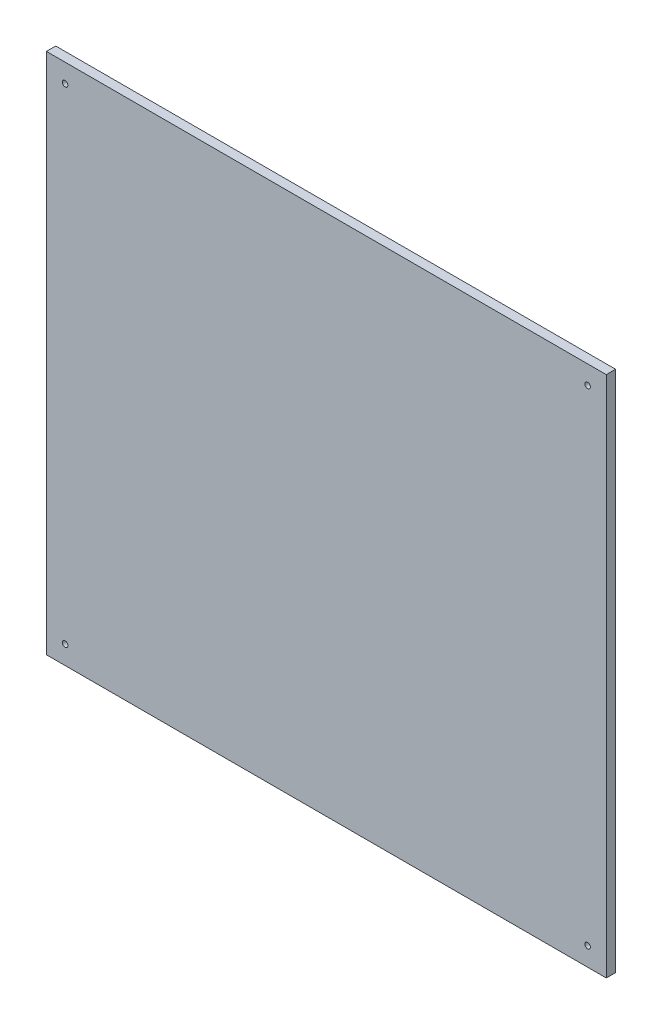
ISO-10303-21;
HEADER;
FILE_DESCRIPTION(('STEP AP214'),'2;1');
FILE_NAME('part.step','',(''),(''),'','','');
FILE_SCHEMA(('AUTOMOTIVE_DESIGN { 1 0 10303 214 1 1 1 1 }'));
ENDSEC;
DATA;
#1=APPLICATION_CONTEXT('core data for automotive mechanical design processes');
#2=APPLICATION_PROTOCOL_DEFINITION('international standard','automotive_design',2000,#1);
#3=PRODUCT_CONTEXT('',#1,'mechanical');
#4=PRODUCT('Part','Part','',(#3));
#5=PRODUCT_RELATED_PRODUCT_CATEGORY('part','',(#4));
#6=PRODUCT_DEFINITION_FORMATION('','',#4);
#7=PRODUCT_DEFINITION_CONTEXT('part definition',#1,'design');
#8=PRODUCT_DEFINITION('design','',#6,#7);
#9=PRODUCT_DEFINITION_SHAPE('','',#8);
#10=(LENGTH_UNIT() NAMED_UNIT(*) SI_UNIT(.MILLI.,.METRE.));
#11=(NAMED_UNIT(*) PLANE_ANGLE_UNIT() SI_UNIT($,.RADIAN.));
#12=(NAMED_UNIT(*) SI_UNIT($,.STERADIAN.) SOLID_ANGLE_UNIT());
#13=UNCERTAINTY_MEASURE_WITH_UNIT(LENGTH_MEASURE(1.E-05),#10,'distance_accuracy_value','');
#14=(GEOMETRIC_REPRESENTATION_CONTEXT(3) GLOBAL_UNCERTAINTY_ASSIGNED_CONTEXT((#13)) GLOBAL_UNIT_ASSIGNED_CONTEXT((#10,
#11,#12)) REPRESENTATION_CONTEXT('',''));
#15=CARTESIAN_POINT('',(0.,0.,0.));
#16=DIRECTION('',(0.,0.,1.));
#17=DIRECTION('',(1.,0.,0.));
#18=AXIS2_PLACEMENT_3D('',#15,#16,#17);
#19=CARTESIAN_POINT('',(0.,0.,5.));
#20=DIRECTION('',(1.,0.,0.));
#21=DIRECTION('',(0.,0.,-1.));
#22=AXIS2_PLACEMENT_3D('',#19,#20,#21);
#23=PLANE('',#22);
#24=DIRECTION('',(0.,-1.,0.));
#25=VECTOR('',#24,1.);
#26=CARTESIAN_POINT('',(0.,0.,0.));
#27=LINE('',#26,#25);
#28=CARTESIAN_POINT('',(0.,280.,0.));
#29=VERTEX_POINT('',#28);
#30=CARTESIAN_POINT('',(0.,0.,0.));
#31=VERTEX_POINT('',#30);
#32=EDGE_CURVE('E96',#29,#31,#27,.T.);
#33=ORIENTED_EDGE('',*,*,#32,.T.);
#34=DIRECTION('',(0.,0.,-1.));
#35=VECTOR('',#34,1.);
#36=CARTESIAN_POINT('',(0.,0.,5.));
#37=LINE('',#36,#35);
#38=CARTESIAN_POINT('',(0.,0.,5.));
#39=VERTEX_POINT('',#38);
#40=EDGE_CURVE('E11',#39,#31,#37,.T.);
#41=ORIENTED_EDGE('',*,*,#40,.F.);
#42=DIRECTION('',(0.,-1.,0.));
#43=VECTOR('',#42,1.);
#44=CARTESIAN_POINT('',(0.,0.,5.));
#45=LINE('',#44,#43);
#46=CARTESIAN_POINT('',(0.,280.,5.));
#47=VERTEX_POINT('',#46);
#48=EDGE_CURVE('E84',#47,#39,#45,.T.);
#49=ORIENTED_EDGE('',*,*,#48,.F.);
#50=DIRECTION('',(0.,0.,-1.));
#51=VECTOR('',#50,1.);
#52=CARTESIAN_POINT('',(0.,280.,5.));
#53=LINE('',#52,#51);
#54=EDGE_CURVE('E92',#47,#29,#53,.T.);
#55=ORIENTED_EDGE('',*,*,#54,.T.);
#56=EDGE_LOOP('',(#33,#41,#49,#55));
#57=FACE_BOUND('',#56,.T.);
#58=ADVANCED_FACE('F33',(#57),#23,.F.);
#59=CARTESIAN_POINT('',(0.,0.,5.));
#60=DIRECTION('',(0.,1.,0.));
#61=DIRECTION('',(0.,0.,1.));
#62=AXIS2_PLACEMENT_3D('',#59,#60,#61);
#63=PLANE('',#62);
#64=DIRECTION('',(1.,0.,0.));
#65=VECTOR('',#64,1.);
#66=CARTESIAN_POINT('',(0.,0.,0.));
#67=LINE('',#66,#65);
#68=CARTESIAN_POINT('',(300.,0.,0.));
#69=VERTEX_POINT('',#68);
#70=EDGE_CURVE('E88',#31,#69,#67,.T.);
#71=ORIENTED_EDGE('',*,*,#70,.T.);
#72=DIRECTION('',(0.,0.,-1.));
#73=VECTOR('',#72,1.);
#74=CARTESIAN_POINT('',(300.,0.,5.));
#75=LINE('',#74,#73);
#76=CARTESIAN_POINT('',(300.,0.,5.));
#77=VERTEX_POINT('',#76);
#78=EDGE_CURVE('E41',#77,#69,#75,.T.);
#79=ORIENTED_EDGE('',*,*,#78,.F.);
#80=DIRECTION('',(1.,0.,0.));
#81=VECTOR('',#80,1.);
#82=CARTESIAN_POINT('',(0.,0.,5.));
#83=LINE('',#82,#81);
#84=EDGE_CURVE('E79',#39,#77,#83,.T.);
#85=ORIENTED_EDGE('',*,*,#84,.F.);
#86=ORIENTED_EDGE('',*,*,#40,.T.);
#87=EDGE_LOOP('',(#71,#79,#85,#86));
#88=FACE_BOUND('',#87,.T.);
#89=ADVANCED_FACE('F87',(#88),#63,.F.);
#90=CARTESIAN_POINT('',(300.,0.,5.));
#91=DIRECTION('',(-1.,0.,0.));
#92=DIRECTION('',(0.,0.,1.));
#93=AXIS2_PLACEMENT_3D('',#90,#91,#92);
#94=PLANE('',#93);
#95=DIRECTION('',(0.,1.,0.));
#96=VECTOR('',#95,1.);
#97=CARTESIAN_POINT('',(300.,0.,0.));
#98=LINE('',#97,#96);
#99=CARTESIAN_POINT('',(300.,280.,0.));
#100=VERTEX_POINT('',#99);
#101=EDGE_CURVE('E66',#69,#100,#98,.T.);
#102=ORIENTED_EDGE('',*,*,#101,.T.);
#103=DIRECTION('',(0.,0.,-1.));
#104=VECTOR('',#103,1.);
#105=CARTESIAN_POINT('',(300.,280.,5.));
#106=LINE('',#105,#104);
#107=CARTESIAN_POINT('',(300.,280.,5.));
#108=VERTEX_POINT('',#107);
#109=EDGE_CURVE('E89',#108,#100,#106,.T.);
#110=ORIENTED_EDGE('',*,*,#109,.F.);
#111=DIRECTION('',(0.,1.,0.));
#112=VECTOR('',#111,1.);
#113=CARTESIAN_POINT('',(300.,0.,5.));
#114=LINE('',#113,#112);
#115=EDGE_CURVE('E82',#77,#108,#114,.T.);
#116=ORIENTED_EDGE('',*,*,#115,.F.);
#117=ORIENTED_EDGE('',*,*,#78,.T.);
#118=EDGE_LOOP('',(#102,#110,#116,#117));
#119=FACE_BOUND('',#118,.T.);
#120=ADVANCED_FACE('F90',(#119),#94,.F.);
#121=CARTESIAN_POINT('',(0.,280.,5.));
#122=DIRECTION('',(0.,-1.,0.));
#123=DIRECTION('',(0.,0.,-1.));
#124=AXIS2_PLACEMENT_3D('',#121,#122,#123);
#125=PLANE('',#124);
#126=DIRECTION('',(-1.,0.,0.));
#127=VECTOR('',#126,1.);
#128=CARTESIAN_POINT('',(0.,280.,0.));
#129=LINE('',#128,#127);
#130=EDGE_CURVE('E72',#100,#29,#129,.T.);
#131=ORIENTED_EDGE('',*,*,#130,.T.);
#132=ORIENTED_EDGE('',*,*,#54,.F.);
#133=DIRECTION('',(-1.,0.,0.));
#134=VECTOR('',#133,1.);
#135=CARTESIAN_POINT('',(0.,280.,5.));
#136=LINE('',#135,#134);
#137=EDGE_CURVE('E49',#108,#47,#136,.T.);
#138=ORIENTED_EDGE('',*,*,#137,.F.);
#139=ORIENTED_EDGE('',*,*,#109,.T.);
#140=EDGE_LOOP('',(#131,#132,#138,#139));
#141=FACE_BOUND('',#140,.T.);
#142=ADVANCED_FACE('F104',(#141),#125,.F.);
#143=CARTESIAN_POINT('',(0.,0.,5.));
#144=DIRECTION('',(0.,0.,-1.));
#145=DIRECTION('',(-1.,0.,0.));
#146=AXIS2_PLACEMENT_3D('',#143,#144,#145);
#147=PLANE('',#146);
#148=CARTESIAN_POINT('',(290.,270.,5.));
#149=DIRECTION('',(0.,0.,1.));
#150=DIRECTION('',(1.,0.,0.));
#151=AXIS2_PLACEMENT_3D('',#148,#149,#150);
#152=CIRCLE('',#151,1.50000000000002);
#153=CARTESIAN_POINT('',(291.5,270.,5.));
#154=VERTEX_POINT('',#153);
#155=EDGE_CURVE('E113',#154,#154,#152,.T.);
#156=ORIENTED_EDGE('',*,*,#155,.F.);
#157=EDGE_LOOP('',(#156));
#158=FACE_BOUND('',#157,.T.);
#159=CARTESIAN_POINT('',(290.,10.,5.));
#160=DIRECTION('',(0.,0.,1.));
#161=DIRECTION('',(1.,0.,0.));
#162=AXIS2_PLACEMENT_3D('',#159,#160,#161);
#163=CIRCLE('',#162,1.50000000000002);
#164=CARTESIAN_POINT('',(291.5,10.,5.));
#165=VERTEX_POINT('',#164);
#166=EDGE_CURVE('E125',#165,#165,#163,.T.);
#167=ORIENTED_EDGE('',*,*,#166,.F.);
#168=EDGE_LOOP('',(#167));
#169=FACE_BOUND('',#168,.T.);
#170=CARTESIAN_POINT('',(10.,10.,5.));
#171=DIRECTION('',(0.,0.,1.));
#172=DIRECTION('',(1.,0.,0.));
#173=AXIS2_PLACEMENT_3D('',#170,#171,#172);
#174=CIRCLE('',#173,1.5);
#175=CARTESIAN_POINT('',(11.5,10.,5.));
#176=VERTEX_POINT('',#175);
#177=EDGE_CURVE('E119',#176,#176,#174,.T.);
#178=ORIENTED_EDGE('',*,*,#177,.F.);
#179=EDGE_LOOP('',(#178));
#180=FACE_BOUND('',#179,.T.);
#181=CARTESIAN_POINT('',(10.,270.,5.));
#182=DIRECTION('',(0.,0.,1.));
#183=DIRECTION('',(1.,0.,0.));
#184=AXIS2_PLACEMENT_3D('',#181,#182,#183);
#185=CIRCLE('',#184,1.5);
#186=CARTESIAN_POINT('',(11.5,270.,5.));
#187=VERTEX_POINT('',#186);
#188=EDGE_CURVE('E99',#187,#187,#185,.T.);
#189=ORIENTED_EDGE('',*,*,#188,.F.);
#190=EDGE_LOOP('',(#189));
#191=FACE_BOUND('',#190,.T.);
#192=ORIENTED_EDGE('',*,*,#48,.T.);
#193=ORIENTED_EDGE('',*,*,#84,.T.);
#194=ORIENTED_EDGE('',*,*,#115,.T.);
#195=ORIENTED_EDGE('',*,*,#137,.T.);
#196=EDGE_LOOP('',(#192,#193,#194,#195));
#197=FACE_BOUND('',#196,.T.);
#198=ADVANCED_FACE('F80',(#158,#169,#180,#191,#197),#147,.F.);
#199=CARTESIAN_POINT('',(0.,0.,0.));
#200=DIRECTION('',(0.,0.,-1.));
#201=DIRECTION('',(-1.,0.,0.));
#202=AXIS2_PLACEMENT_3D('',#199,#200,#201);
#203=PLANE('',#202);
#204=CARTESIAN_POINT('',(290.,270.,0.));
#205=DIRECTION('',(0.,0.,1.));
#206=DIRECTION('',(1.,0.,0.));
#207=AXIS2_PLACEMENT_3D('',#204,#205,#206);
#208=CIRCLE('',#207,1.50000000000002);
#209=CARTESIAN_POINT('',(291.5,270.,0.));
#210=VERTEX_POINT('',#209);
#211=EDGE_CURVE('E128',#210,#210,#208,.T.);
#212=ORIENTED_EDGE('',*,*,#211,.T.);
#213=EDGE_LOOP('',(#212));
#214=FACE_BOUND('',#213,.T.);
#215=CARTESIAN_POINT('',(290.,10.,0.));
#216=DIRECTION('',(0.,0.,1.));
#217=DIRECTION('',(1.,0.,0.));
#218=AXIS2_PLACEMENT_3D('',#215,#216,#217);
#219=CIRCLE('',#218,1.50000000000002);
#220=CARTESIAN_POINT('',(291.5,10.,0.));
#221=VERTEX_POINT('',#220);
#222=EDGE_CURVE('E122',#221,#221,#219,.T.);
#223=ORIENTED_EDGE('',*,*,#222,.T.);
#224=EDGE_LOOP('',(#223));
#225=FACE_BOUND('',#224,.T.);
#226=CARTESIAN_POINT('',(10.,10.,0.));
#227=DIRECTION('',(0.,0.,1.));
#228=DIRECTION('',(1.,0.,0.));
#229=AXIS2_PLACEMENT_3D('',#226,#227,#228);
#230=CIRCLE('',#229,1.5);
#231=CARTESIAN_POINT('',(11.5,10.,0.));
#232=VERTEX_POINT('',#231);
#233=EDGE_CURVE('E116',#232,#232,#230,.T.);
#234=ORIENTED_EDGE('',*,*,#233,.T.);
#235=EDGE_LOOP('',(#234));
#236=FACE_BOUND('',#235,.T.);
#237=CARTESIAN_POINT('',(10.,270.,0.));
#238=DIRECTION('',(0.,0.,1.));
#239=DIRECTION('',(1.,0.,0.));
#240=AXIS2_PLACEMENT_3D('',#237,#238,#239);
#241=CIRCLE('',#240,1.5);
#242=CARTESIAN_POINT('',(11.5,270.,0.));
#243=VERTEX_POINT('',#242);
#244=EDGE_CURVE('E110',#243,#243,#241,.T.);
#245=ORIENTED_EDGE('',*,*,#244,.T.);
#246=EDGE_LOOP('',(#245));
#247=FACE_BOUND('',#246,.T.);
#248=ORIENTED_EDGE('',*,*,#32,.F.);
#249=ORIENTED_EDGE('',*,*,#130,.F.);
#250=ORIENTED_EDGE('',*,*,#101,.F.);
#251=ORIENTED_EDGE('',*,*,#70,.F.);
#252=EDGE_LOOP('',(#248,#249,#250,#251));
#253=FACE_BOUND('',#252,.T.);
#254=ADVANCED_FACE('F107',(#214,#225,#236,#247,#253),#203,.T.);
#255=CARTESIAN_POINT('',(10.,270.,5.));
#256=DIRECTION('',(0.,0.,-1.));
#257=DIRECTION('',(-1.,0.,0.));
#258=AXIS2_PLACEMENT_3D('',#255,#256,#257);
#259=CYLINDRICAL_SURFACE('',#258,1.5);
#260=ORIENTED_EDGE('',*,*,#188,.T.);
#261=EDGE_LOOP('',(#260));
#262=FACE_BOUND('',#261,.T.);
#263=ORIENTED_EDGE('',*,*,#244,.F.);
#264=EDGE_LOOP('',(#263));
#265=FACE_BOUND('',#264,.T.);
#266=ADVANCED_FACE('F146',(#262,#265),#259,.F.);
#267=CARTESIAN_POINT('',(10.,10.,5.));
#268=DIRECTION('',(0.,0.,-1.));
#269=DIRECTION('',(-1.,0.,0.));
#270=AXIS2_PLACEMENT_3D('',#267,#268,#269);
#271=CYLINDRICAL_SURFACE('',#270,1.5);
#272=ORIENTED_EDGE('',*,*,#177,.T.);
#273=EDGE_LOOP('',(#272));
#274=FACE_BOUND('',#273,.T.);
#275=ORIENTED_EDGE('',*,*,#233,.F.);
#276=EDGE_LOOP('',(#275));
#277=FACE_BOUND('',#276,.T.);
#278=ADVANCED_FACE('F149',(#274,#277),#271,.F.);
#279=CARTESIAN_POINT('',(290.,10.,5.));
#280=DIRECTION('',(0.,0.,-1.));
#281=DIRECTION('',(-1.,0.,0.));
#282=AXIS2_PLACEMENT_3D('',#279,#280,#281);
#283=CYLINDRICAL_SURFACE('',#282,1.50000000000002);
#284=ORIENTED_EDGE('',*,*,#166,.T.);
#285=EDGE_LOOP('',(#284));
#286=FACE_BOUND('',#285,.T.);
#287=ORIENTED_EDGE('',*,*,#222,.F.);
#288=EDGE_LOOP('',(#287));
#289=FACE_BOUND('',#288,.T.);
#290=ADVANCED_FACE('F196',(#286,#289),#283,.F.);
#291=CARTESIAN_POINT('',(290.,270.,5.));
#292=DIRECTION('',(0.,0.,-1.));
#293=DIRECTION('',(-1.,0.,0.));
#294=AXIS2_PLACEMENT_3D('',#291,#292,#293);
#295=CYLINDRICAL_SURFACE('',#294,1.50000000000002);
#296=ORIENTED_EDGE('',*,*,#155,.T.);
#297=EDGE_LOOP('',(#296));
#298=FACE_BOUND('',#297,.T.);
#299=ORIENTED_EDGE('',*,*,#211,.F.);
#300=EDGE_LOOP('',(#299));
#301=FACE_BOUND('',#300,.T.);
#302=ADVANCED_FACE('F134',(#298,#301),#295,.F.);
#303=CLOSED_SHELL('',(#58,#89,#120,#142,#198,#254,#266,#278,#290,#302));
#304=MANIFOLD_SOLID_BREP('B2',#303);
#305=ADVANCED_BREP_SHAPE_REPRESENTATION('',(#18,#304),#14);
#306=SHAPE_DEFINITION_REPRESENTATION(#9,#305);
ENDSEC;
END-ISO-10303-21;
